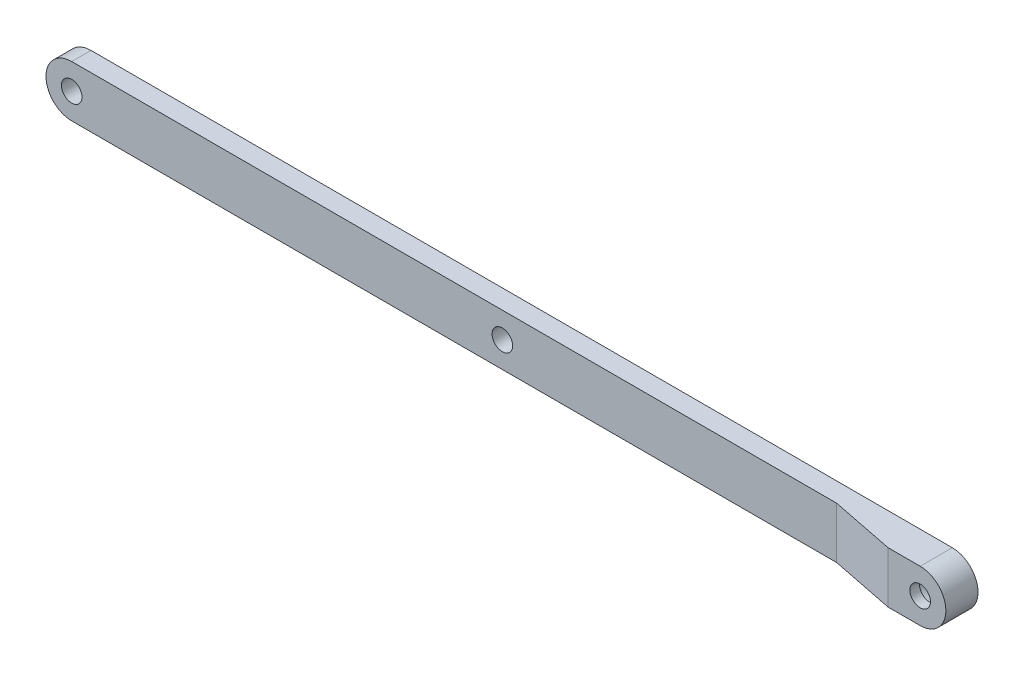
ISO-10303-21;
HEADER;
FILE_DESCRIPTION(('STEP AP214'),'2;1');
FILE_NAME('part.step','',(''),(''),'','','');
FILE_SCHEMA(('AUTOMOTIVE_DESIGN { 1 0 10303 214 1 1 1 1 }'));
ENDSEC;
DATA;
#1=APPLICATION_CONTEXT('core data for automotive mechanical design processes');
#2=APPLICATION_PROTOCOL_DEFINITION('international standard','automotive_design',2000,#1);
#3=PRODUCT_CONTEXT('',#1,'mechanical');
#4=PRODUCT('Part','Part','',(#3));
#5=PRODUCT_RELATED_PRODUCT_CATEGORY('part','',(#4));
#6=PRODUCT_DEFINITION_FORMATION('','',#4);
#7=PRODUCT_DEFINITION_CONTEXT('part definition',#1,'design');
#8=PRODUCT_DEFINITION('design','',#6,#7);
#9=PRODUCT_DEFINITION_SHAPE('','',#8);
#10=(LENGTH_UNIT() NAMED_UNIT(*) SI_UNIT(.MILLI.,.METRE.));
#11=(NAMED_UNIT(*) PLANE_ANGLE_UNIT() SI_UNIT($,.RADIAN.));
#12=(NAMED_UNIT(*) SI_UNIT($,.STERADIAN.) SOLID_ANGLE_UNIT());
#13=UNCERTAINTY_MEASURE_WITH_UNIT(LENGTH_MEASURE(1.E-05),#10,'distance_accuracy_value','');
#14=(GEOMETRIC_REPRESENTATION_CONTEXT(3) GLOBAL_UNCERTAINTY_ASSIGNED_CONTEXT((#13)) GLOBAL_UNIT_ASSIGNED_CONTEXT((#10,
#11,#12)) REPRESENTATION_CONTEXT('',''));
#15=CARTESIAN_POINT('',(0.,0.,0.));
#16=DIRECTION('',(0.,0.,1.));
#17=DIRECTION('',(1.,0.,0.));
#18=AXIS2_PLACEMENT_3D('',#15,#16,#17);
#19=CARTESIAN_POINT('',(-53.1112918089662,0.,5.));
#20=DIRECTION('',(0.,0.,-1.));
#21=DIRECTION('',(-1.,0.,0.));
#22=AXIS2_PLACEMENT_3D('',#19,#20,#21);
#23=CYLINDRICAL_SURFACE('',#22,4.);
#24=CARTESIAN_POINT('',(-53.1112918089662,0.,3.));
#25=DIRECTION('',(0.,0.,1.));
#26=DIRECTION('',(1.,0.,0.));
#27=AXIS2_PLACEMENT_3D('',#24,#25,#26);
#28=CIRCLE('',#27,4.);
#29=CARTESIAN_POINT('',(-53.1112918089662,3.99999999999998,3.));
#30=VERTEX_POINT('',#29);
#31=CARTESIAN_POINT('',(-53.1112918089662,-4.00000000000002,3.));
#32=VERTEX_POINT('',#31);
#33=EDGE_CURVE('E104',#30,#32,#28,.T.);
#34=ORIENTED_EDGE('',*,*,#33,.F.);
#35=DIRECTION('',(0.,0.,-1.));
#36=VECTOR('',#35,1.);
#37=CARTESIAN_POINT('',(-53.1112918089662,4.,5.));
#38=LINE('',#37,#36);
#39=CARTESIAN_POINT('',(-53.1112918089662,4.,0.));
#40=VERTEX_POINT('',#39);
#41=EDGE_CURVE('E142',#30,#40,#38,.T.);
#42=ORIENTED_EDGE('',*,*,#41,.T.);
#43=CARTESIAN_POINT('',(-53.1112918089662,0.,0.));
#44=DIRECTION('',(0.,0.,1.));
#45=DIRECTION('',(1.,0.,0.));
#46=AXIS2_PLACEMENT_3D('',#43,#44,#45);
#47=CIRCLE('',#46,4.);
#48=CARTESIAN_POINT('',(-53.1112918089662,-4.,0.));
#49=VERTEX_POINT('',#48);
#50=EDGE_CURVE('E135',#40,#49,#47,.T.);
#51=ORIENTED_EDGE('',*,*,#50,.T.);
#52=DIRECTION('',(0.,0.,-1.));
#53=VECTOR('',#52,1.);
#54=CARTESIAN_POINT('',(-53.1112918089662,-4.,5.));
#55=LINE('',#54,#53);
#56=EDGE_CURVE('E158',#32,#49,#55,.T.);
#57=ORIENTED_EDGE('',*,*,#56,.F.);
#58=EDGE_LOOP('',(#34,#42,#51,#57));
#59=FACE_BOUND('',#58,.T.);
#60=ADVANCED_FACE('F38',(#59),#23,.T.);
#61=CARTESIAN_POINT('',(-53.1112918089662,0.,5.));
#62=DIRECTION('',(0.,0.,-1.));
#63=DIRECTION('',(-1.,0.,0.));
#64=AXIS2_PLACEMENT_3D('',#61,#62,#63);
#65=CYLINDRICAL_SURFACE('',#64,1.6);
#66=CARTESIAN_POINT('',(-53.1112918089662,0.,0.));
#67=DIRECTION('',(0.,0.,1.));
#68=DIRECTION('',(1.,0.,0.));
#69=AXIS2_PLACEMENT_3D('',#66,#67,#68);
#70=CIRCLE('',#69,1.6);
#71=CARTESIAN_POINT('',(-51.5112918089662,0.,0.));
#72=VERTEX_POINT('',#71);
#73=EDGE_CURVE('E129',#72,#72,#70,.T.);
#74=ORIENTED_EDGE('',*,*,#73,.F.);
#75=EDGE_LOOP('',(#74));
#76=FACE_BOUND('',#75,.T.);
#77=CARTESIAN_POINT('',(-53.1112918089662,0.,3.));
#78=DIRECTION('',(0.,0.,1.));
#79=DIRECTION('',(1.,0.,0.));
#80=AXIS2_PLACEMENT_3D('',#77,#78,#79);
#81=CIRCLE('',#80,1.6);
#82=CARTESIAN_POINT('',(-51.5112918089662,0.,3.));
#83=VERTEX_POINT('',#82);
#84=EDGE_CURVE('E110',#83,#83,#81,.T.);
#85=ORIENTED_EDGE('',*,*,#84,.T.);
#86=EDGE_LOOP('',(#85));
#87=FACE_BOUND('',#86,.T.);
#88=ADVANCED_FACE('F196',(#76,#87),#65,.F.);
#89=CARTESIAN_POINT('',(13.8887081910338,0.,5.));
#90=DIRECTION('',(0.,0.,-1.));
#91=DIRECTION('',(-1.,0.,0.));
#92=AXIS2_PLACEMENT_3D('',#89,#90,#91);
#93=CYLINDRICAL_SURFACE('',#92,1.6);
#94=CARTESIAN_POINT('',(13.8887081910338,0.,0.));
#95=DIRECTION('',(0.,0.,1.));
#96=DIRECTION('',(1.,0.,0.));
#97=AXIS2_PLACEMENT_3D('',#94,#95,#96);
#98=CIRCLE('',#97,1.6);
#99=CARTESIAN_POINT('',(15.4887081910338,0.,0.));
#100=VERTEX_POINT('',#99);
#101=EDGE_CURVE('E126',#100,#100,#98,.T.);
#102=ORIENTED_EDGE('',*,*,#101,.F.);
#103=EDGE_LOOP('',(#102));
#104=FACE_BOUND('',#103,.T.);
#105=CARTESIAN_POINT('',(13.8887081910338,0.,3.));
#106=DIRECTION('',(0.,0.,1.));
#107=DIRECTION('',(1.,0.,0.));
#108=AXIS2_PLACEMENT_3D('',#105,#106,#107);
#109=CIRCLE('',#108,1.6);
#110=CARTESIAN_POINT('',(15.4887081910338,0.,3.));
#111=VERTEX_POINT('',#110);
#112=EDGE_CURVE('E107',#111,#111,#109,.T.);
#113=ORIENTED_EDGE('',*,*,#112,.T.);
#114=EDGE_LOOP('',(#113));
#115=FACE_BOUND('',#114,.T.);
#116=ADVANCED_FACE('F200',(#104,#115),#93,.F.);
#117=CARTESIAN_POINT('',(80.8887081910338,0.,5.));
#118=DIRECTION('',(0.,0.,-1.));
#119=DIRECTION('',(-1.,0.,0.));
#120=AXIS2_PLACEMENT_3D('',#117,#118,#119);
#121=CYLINDRICAL_SURFACE('',#120,2.75000000000001);
#122=CARTESIAN_POINT('',(80.8887081910338,0.,0.));
#123=DIRECTION('',(0.,0.,1.));
#124=DIRECTION('',(1.,0.,0.));
#125=AXIS2_PLACEMENT_3D('',#122,#123,#124);
#126=CIRCLE('',#125,2.75000000000001);
#127=CARTESIAN_POINT('',(83.6387081910338,0.,0.));
#128=VERTEX_POINT('',#127);
#129=EDGE_CURVE('E132',#128,#128,#126,.T.);
#130=ORIENTED_EDGE('',*,*,#129,.F.);
#131=EDGE_LOOP('',(#130));
#132=FACE_BOUND('',#131,.T.);
#133=CARTESIAN_POINT('',(80.8887081910338,0.,3.5));
#134=DIRECTION('',(0.,0.,1.));
#135=DIRECTION('',(1.,0.,0.));
#136=AXIS2_PLACEMENT_3D('',#133,#134,#135);
#137=CIRCLE('',#136,2.75000000000001);
#138=CARTESIAN_POINT('',(83.6387081910338,0.,3.5));
#139=VERTEX_POINT('',#138);
#140=EDGE_CURVE('E121',#139,#139,#137,.T.);
#141=ORIENTED_EDGE('',*,*,#140,.T.);
#142=EDGE_LOOP('',(#141));
#143=FACE_BOUND('',#142,.T.);
#144=ADVANCED_FACE('F177',(#132,#143),#121,.F.);
#145=CARTESIAN_POINT('',(-53.1112918089662,0.,5.));
#146=DIRECTION('',(0.,0.,1.));
#147=DIRECTION('',(1.,0.,0.));
#148=AXIS2_PLACEMENT_3D('',#145,#146,#147);
#149=PLANE('',#148);
#150=DIRECTION('',(-1.,0.,0.));
#151=VECTOR('',#150,1.);
#152=CARTESIAN_POINT('',(-53.1112918089662,4.,5.));
#153=LINE('',#152,#151);
#154=CARTESIAN_POINT('',(80.8887081910338,4.,5.));
#155=VERTEX_POINT('',#154);
#156=CARTESIAN_POINT('',(75.888708191034,4.,5.));
#157=VERTEX_POINT('',#156);
#158=EDGE_CURVE('E140',#155,#157,#153,.T.);
#159=ORIENTED_EDGE('',*,*,#158,.T.);
#160=DIRECTION('',(0.,-1.,0.));
#161=VECTOR('',#160,1.);
#162=CARTESIAN_POINT('',(75.888708191034,-3.99999999999998,5.));
#163=LINE('',#162,#161);
#164=CARTESIAN_POINT('',(75.888708191034,-4.,5.));
#165=VERTEX_POINT('',#164);
#166=EDGE_CURVE('E47',#157,#165,#163,.T.);
#167=ORIENTED_EDGE('',*,*,#166,.T.);
#168=DIRECTION('',(1.,0.,0.));
#169=VECTOR('',#168,1.);
#170=CARTESIAN_POINT('',(-53.1112918089662,-4.,5.));
#171=LINE('',#170,#169);
#172=CARTESIAN_POINT('',(80.8887081910338,-4.,5.));
#173=VERTEX_POINT('',#172);
#174=EDGE_CURVE('E96',#165,#173,#171,.T.);
#175=ORIENTED_EDGE('',*,*,#174,.T.);
#176=CARTESIAN_POINT('',(80.8887081910338,0.,5.));
#177=DIRECTION('',(0.,0.,1.));
#178=DIRECTION('',(1.,0.,0.));
#179=AXIS2_PLACEMENT_3D('',#176,#177,#178);
#180=CIRCLE('',#179,4.);
#181=EDGE_CURVE('E137',#173,#155,#180,.T.);
#182=ORIENTED_EDGE('',*,*,#181,.T.);
#183=EDGE_LOOP('',(#159,#167,#175,#182));
#184=FACE_BOUND('',#183,.T.);
#185=CARTESIAN_POINT('',(80.8887081910338,0.,5.));
#186=DIRECTION('',(0.,0.,1.));
#187=DIRECTION('',(1.,0.,0.));
#188=AXIS2_PLACEMENT_3D('',#185,#186,#187);
#189=CIRCLE('',#188,1.60000000000001);
#190=CARTESIAN_POINT('',(82.4887081910338,0.,5.));
#191=VERTEX_POINT('',#190);
#192=EDGE_CURVE('E117',#191,#191,#189,.T.);
#193=ORIENTED_EDGE('',*,*,#192,.F.);
#194=EDGE_LOOP('',(#193));
#195=FACE_BOUND('',#194,.T.);
#196=ADVANCED_FACE('F174',(#184,#195),#149,.T.);
#197=CARTESIAN_POINT('',(-53.1112918089662,0.,0.));
#198=DIRECTION('',(0.,0.,1.));
#199=DIRECTION('',(1.,0.,0.));
#200=AXIS2_PLACEMENT_3D('',#197,#198,#199);
#201=PLANE('',#200);
#202=ORIENTED_EDGE('',*,*,#50,.F.);
#203=DIRECTION('',(-1.,0.,0.));
#204=VECTOR('',#203,1.);
#205=CARTESIAN_POINT('',(-53.1112918089662,4.,0.));
#206=LINE('',#205,#204);
#207=CARTESIAN_POINT('',(80.8887081910338,4.,0.));
#208=VERTEX_POINT('',#207);
#209=EDGE_CURVE('E138',#208,#40,#206,.T.);
#210=ORIENTED_EDGE('',*,*,#209,.F.);
#211=CARTESIAN_POINT('',(80.8887081910338,0.,0.));
#212=DIRECTION('',(0.,0.,1.));
#213=DIRECTION('',(1.,0.,0.));
#214=AXIS2_PLACEMENT_3D('',#211,#212,#213);
#215=CIRCLE('',#214,4.);
#216=CARTESIAN_POINT('',(80.8887081910338,-4.,0.));
#217=VERTEX_POINT('',#216);
#218=EDGE_CURVE('E147',#217,#208,#215,.T.);
#219=ORIENTED_EDGE('',*,*,#218,.F.);
#220=DIRECTION('',(1.,0.,0.));
#221=VECTOR('',#220,1.);
#222=CARTESIAN_POINT('',(-53.1112918089662,-4.,0.));
#223=LINE('',#222,#221);
#224=EDGE_CURVE('E145',#49,#217,#223,.T.);
#225=ORIENTED_EDGE('',*,*,#224,.F.);
#226=EDGE_LOOP('',(#202,#210,#219,#225));
#227=FACE_BOUND('',#226,.T.);
#228=ORIENTED_EDGE('',*,*,#129,.T.);
#229=EDGE_LOOP('',(#228));
#230=FACE_BOUND('',#229,.T.);
#231=ORIENTED_EDGE('',*,*,#73,.T.);
#232=EDGE_LOOP('',(#231));
#233=FACE_BOUND('',#232,.T.);
#234=ORIENTED_EDGE('',*,*,#101,.T.);
#235=EDGE_LOOP('',(#234));
#236=FACE_BOUND('',#235,.T.);
#237=ADVANCED_FACE('F165',(#227,#230,#233,#236),#201,.F.);
#238=CARTESIAN_POINT('',(-53.1112918089662,-4.,5.));
#239=DIRECTION('',(0.,1.,0.));
#240=DIRECTION('',(0.,0.,1.));
#241=AXIS2_PLACEMENT_3D('',#238,#239,#240);
#242=PLANE('',#241);
#243=ORIENTED_EDGE('',*,*,#174,.F.);
#244=DIRECTION('',(-0.980580675690921,0.,-0.19611613513818));
#245=VECTOR('',#244,1.);
#246=CARTESIAN_POINT('',(65.8887081910338,-4.,3.));
#247=LINE('',#246,#245);
#248=CARTESIAN_POINT('',(65.8887081910338,-4.,3.));
#249=VERTEX_POINT('',#248);
#250=EDGE_CURVE('E11',#165,#249,#247,.T.);
#251=ORIENTED_EDGE('',*,*,#250,.T.);
#252=DIRECTION('',(1.,0.,0.));
#253=VECTOR('',#252,1.);
#254=CARTESIAN_POINT('',(65.8887081910338,-4.,3.));
#255=LINE('',#254,#253);
#256=EDGE_CURVE('E93',#32,#249,#255,.T.);
#257=ORIENTED_EDGE('',*,*,#256,.F.);
#258=ORIENTED_EDGE('',*,*,#56,.T.);
#259=ORIENTED_EDGE('',*,*,#224,.T.);
#260=DIRECTION('',(0.,0.,-1.));
#261=VECTOR('',#260,1.);
#262=CARTESIAN_POINT('',(80.8887081910338,-4.,5.));
#263=LINE('',#262,#261);
#264=EDGE_CURVE('E155',#173,#217,#263,.T.);
#265=ORIENTED_EDGE('',*,*,#264,.F.);
#266=EDGE_LOOP('',(#243,#251,#257,#258,#259,#265));
#267=FACE_BOUND('',#266,.T.);
#268=ADVANCED_FACE('F92',(#267),#242,.F.);
#269=CARTESIAN_POINT('',(80.8887081910338,0.,5.));
#270=DIRECTION('',(0.,0.,-1.));
#271=DIRECTION('',(-1.,0.,0.));
#272=AXIS2_PLACEMENT_3D('',#269,#270,#271);
#273=CYLINDRICAL_SURFACE('',#272,4.);
#274=ORIENTED_EDGE('',*,*,#218,.T.);
#275=DIRECTION('',(0.,0.,-1.));
#276=VECTOR('',#275,1.);
#277=CARTESIAN_POINT('',(80.8887081910338,4.,5.));
#278=LINE('',#277,#276);
#279=EDGE_CURVE('E152',#155,#208,#278,.T.);
#280=ORIENTED_EDGE('',*,*,#279,.F.);
#281=ORIENTED_EDGE('',*,*,#181,.F.);
#282=ORIENTED_EDGE('',*,*,#264,.T.);
#283=EDGE_LOOP('',(#274,#280,#281,#282));
#284=FACE_BOUND('',#283,.T.);
#285=ADVANCED_FACE('F173',(#284),#273,.T.);
#286=CARTESIAN_POINT('',(-53.1112918089662,4.,5.));
#287=DIRECTION('',(0.,-1.,0.));
#288=DIRECTION('',(0.,0.,-1.));
#289=AXIS2_PLACEMENT_3D('',#286,#287,#288);
#290=PLANE('',#289);
#291=DIRECTION('',(-1.,0.,0.));
#292=VECTOR('',#291,1.);
#293=CARTESIAN_POINT('',(65.8887081910338,4.,3.));
#294=LINE('',#293,#292);
#295=CARTESIAN_POINT('',(65.8887081910338,4.,3.));
#296=VERTEX_POINT('',#295);
#297=EDGE_CURVE('E105',#296,#30,#294,.T.);
#298=ORIENTED_EDGE('',*,*,#297,.F.);
#299=DIRECTION('',(0.980580675690921,0.,0.19611613513818));
#300=VECTOR('',#299,1.);
#301=CARTESIAN_POINT('',(65.8887081910338,4.,3.));
#302=LINE('',#301,#300);
#303=EDGE_CURVE('E61',#296,#157,#302,.T.);
#304=ORIENTED_EDGE('',*,*,#303,.T.);
#305=ORIENTED_EDGE('',*,*,#158,.F.);
#306=ORIENTED_EDGE('',*,*,#279,.T.);
#307=ORIENTED_EDGE('',*,*,#209,.T.);
#308=ORIENTED_EDGE('',*,*,#41,.F.);
#309=EDGE_LOOP('',(#298,#304,#305,#306,#307,#308));
#310=FACE_BOUND('',#309,.T.);
#311=ADVANCED_FACE('F169',(#310),#290,.F.);
#312=CARTESIAN_POINT('',(80.8887081910338,0.,3.5));
#313=DIRECTION('',(0.,0.,1.));
#314=DIRECTION('',(1.,0.,0.));
#315=AXIS2_PLACEMENT_3D('',#312,#313,#314);
#316=PLANE('',#315);
#317=CARTESIAN_POINT('',(80.8887081910338,0.,3.5));
#318=DIRECTION('',(0.,0.,1.));
#319=DIRECTION('',(1.,0.,0.));
#320=AXIS2_PLACEMENT_3D('',#317,#318,#319);
#321=CIRCLE('',#320,1.60000000000001);
#322=CARTESIAN_POINT('',(82.4887081910338,0.,3.5));
#323=VERTEX_POINT('',#322);
#324=EDGE_CURVE('E118',#323,#323,#321,.T.);
#325=ORIENTED_EDGE('',*,*,#324,.T.);
#326=EDGE_LOOP('',(#325));
#327=FACE_BOUND('',#326,.T.);
#328=ORIENTED_EDGE('',*,*,#140,.F.);
#329=EDGE_LOOP('',(#328));
#330=FACE_BOUND('',#329,.T.);
#331=ADVANCED_FACE('F183',(#327,#330),#316,.F.);
#332=CARTESIAN_POINT('',(80.8887081910338,0.,3.5));
#333=DIRECTION('',(0.,0.,1.));
#334=DIRECTION('',(1.,0.,0.));
#335=AXIS2_PLACEMENT_3D('',#332,#333,#334);
#336=CYLINDRICAL_SURFACE('',#335,1.60000000000001);
#337=ORIENTED_EDGE('',*,*,#324,.F.);
#338=EDGE_LOOP('',(#337));
#339=FACE_BOUND('',#338,.T.);
#340=ORIENTED_EDGE('',*,*,#192,.T.);
#341=EDGE_LOOP('',(#340));
#342=FACE_BOUND('',#341,.T.);
#343=ADVANCED_FACE('F181',(#339,#342),#336,.F.);
#344=CARTESIAN_POINT('',(0.,0.,3.));
#345=DIRECTION('',(0.,0.,1.));
#346=DIRECTION('',(1.,0.,0.));
#347=AXIS2_PLACEMENT_3D('',#344,#345,#346);
#348=PLANE('',#347);
#349=ORIENTED_EDGE('',*,*,#112,.F.);
#350=EDGE_LOOP('',(#349));
#351=FACE_BOUND('',#350,.T.);
#352=ORIENTED_EDGE('',*,*,#84,.F.);
#353=EDGE_LOOP('',(#352));
#354=FACE_BOUND('',#353,.T.);
#355=ORIENTED_EDGE('',*,*,#33,.T.);
#356=ORIENTED_EDGE('',*,*,#256,.T.);
#357=DIRECTION('',(0.,1.,0.));
#358=VECTOR('',#357,1.);
#359=CARTESIAN_POINT('',(65.8887081910338,4.,3.));
#360=LINE('',#359,#358);
#361=EDGE_CURVE('E102',#249,#296,#360,.T.);
#362=ORIENTED_EDGE('',*,*,#361,.T.);
#363=ORIENTED_EDGE('',*,*,#297,.T.);
#364=EDGE_LOOP('',(#355,#356,#362,#363));
#365=FACE_BOUND('',#364,.T.);
#366=ADVANCED_FACE('F101',(#351,#354,#365),#348,.T.);
#367=CARTESIAN_POINT('',(65.8887081910338,4.,3.));
#368=DIRECTION('',(-0.19611613513818,0.,0.980580675690921));
#369=DIRECTION('',(0.,-1.,0.));
#370=AXIS2_PLACEMENT_3D('',#367,#368,#369);
#371=PLANE('',#370);
#372=ORIENTED_EDGE('',*,*,#250,.F.);
#373=ORIENTED_EDGE('',*,*,#166,.F.);
#374=ORIENTED_EDGE('',*,*,#303,.F.);
#375=ORIENTED_EDGE('',*,*,#361,.F.);
#376=EDGE_LOOP('',(#372,#373,#374,#375));
#377=FACE_BOUND('',#376,.T.);
#378=ADVANCED_FACE('F41',(#377),#371,.T.);
#379=CLOSED_SHELL('',(#60,#88,#116,#144,#196,#237,#268,#285,#311,#331,#343,#366,#378));
#380=MANIFOLD_SOLID_BREP('B2',#379);
#381=ADVANCED_BREP_SHAPE_REPRESENTATION('',(#18,#380),#14);
#382=SHAPE_DEFINITION_REPRESENTATION(#9,#381);
ENDSEC;
END-ISO-10303-21;
